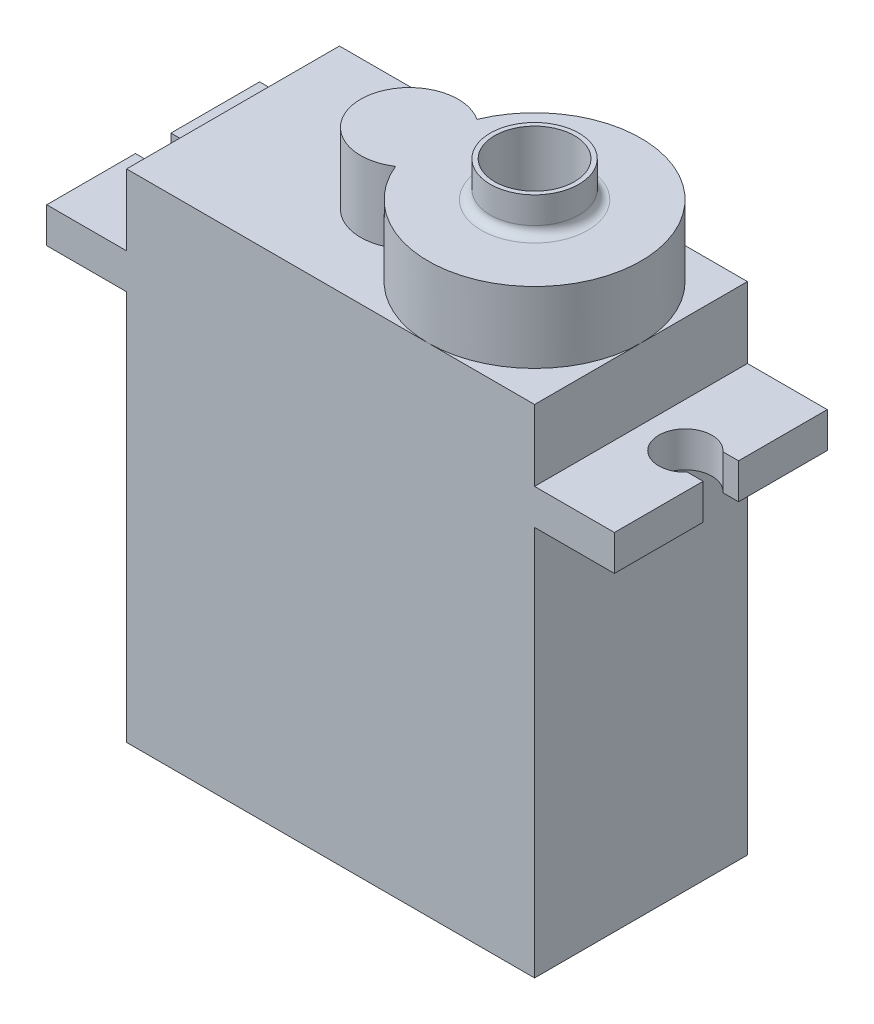
ISO-10303-21;
HEADER;
FILE_DESCRIPTION(('STEP AP214'),'2;1');
FILE_NAME('part.step','',(''),(''),'','','');
FILE_SCHEMA(('AUTOMOTIVE_DESIGN { 1 0 10303 214 1 1 1 1 }'));
ENDSEC;
DATA;
#1=APPLICATION_CONTEXT('core data for automotive mechanical design processes');
#2=APPLICATION_PROTOCOL_DEFINITION('international standard','automotive_design',2000,#1);
#3=PRODUCT_CONTEXT('',#1,'mechanical');
#4=PRODUCT('Part','Part','',(#3));
#5=PRODUCT_RELATED_PRODUCT_CATEGORY('part','',(#4));
#6=PRODUCT_DEFINITION_FORMATION('','',#4);
#7=PRODUCT_DEFINITION_CONTEXT('part definition',#1,'design');
#8=PRODUCT_DEFINITION('design','',#6,#7);
#9=PRODUCT_DEFINITION_SHAPE('','',#8);
#10=(LENGTH_UNIT() NAMED_UNIT(*) SI_UNIT(.MILLI.,.METRE.));
#11=(NAMED_UNIT(*) PLANE_ANGLE_UNIT() SI_UNIT($,.RADIAN.));
#12=(NAMED_UNIT(*) SI_UNIT($,.STERADIAN.) SOLID_ANGLE_UNIT());
#13=UNCERTAINTY_MEASURE_WITH_UNIT(LENGTH_MEASURE(1.E-05),#10,'distance_accuracy_value','');
#14=(GEOMETRIC_REPRESENTATION_CONTEXT(3) GLOBAL_UNCERTAINTY_ASSIGNED_CONTEXT((#13)) GLOBAL_UNIT_ASSIGNED_CONTEXT((#10,
#11,#12)) REPRESENTATION_CONTEXT('',''));
#15=CARTESIAN_POINT('',(0.,0.,0.));
#16=DIRECTION('',(0.,0.,1.));
#17=DIRECTION('',(1.,0.,0.));
#18=AXIS2_PLACEMENT_3D('',#15,#16,#17);
#19=CARTESIAN_POINT('',(0.,28.,0.));
#20=DIRECTION('',(0.,1.,0.));
#21=DIRECTION('',(0.,0.,1.));
#22=AXIS2_PLACEMENT_3D('',#19,#20,#21);
#23=PLANE('',#22);
#24=CARTESIAN_POINT('',(-1.55648325422716,28.,0.));
#25=DIRECTION('',(0.,1.,0.));
#26=DIRECTION('',(0.,0.,1.));
#27=AXIS2_PLACEMENT_3D('',#24,#25,#26);
#28=CIRCLE('',#27,2.75);
#29=CARTESIAN_POINT('',(-0.0432325918384409,28.,-2.2962082729535));
#30=VERTEX_POINT('',#29);
#31=CARTESIAN_POINT('',(-0.0432325918384418,28.,2.2962082729535));
#32=VERTEX_POINT('',#31);
#33=EDGE_CURVE('E220',#30,#32,#28,.T.);
#34=ORIENTED_EDGE('',*,*,#33,.F.);
#35=CARTESIAN_POINT('',(5.5,28.,0.));
#36=DIRECTION('',(0.,1.,0.));
#37=DIRECTION('',(0.,0.,1.));
#38=AXIS2_PLACEMENT_3D('',#35,#36,#37);
#39=CIRCLE('',#38,6.);
#40=CARTESIAN_POINT('',(5.5,28.,-6.));
#41=VERTEX_POINT('',#40);
#42=EDGE_CURVE('E378',#41,#30,#39,.T.);
#43=ORIENTED_EDGE('',*,*,#42,.F.);
#44=DIRECTION('',(-1.,0.,0.));
#45=VECTOR('',#44,1.);
#46=CARTESIAN_POINT('',(-11.5,28.,-6.));
#47=LINE('',#46,#45);
#48=CARTESIAN_POINT('',(-11.5,28.,-6.));
#49=VERTEX_POINT('',#48);
#50=EDGE_CURVE('E231',#41,#49,#47,.T.);
#51=ORIENTED_EDGE('',*,*,#50,.T.);
#52=DIRECTION('',(0.,0.,1.));
#53=VECTOR('',#52,1.);
#54=CARTESIAN_POINT('',(-11.5,28.,-6.));
#55=LINE('',#54,#53);
#56=CARTESIAN_POINT('',(-11.5,28.,6.));
#57=VERTEX_POINT('',#56);
#58=EDGE_CURVE('E236',#49,#57,#55,.T.);
#59=ORIENTED_EDGE('',*,*,#58,.T.);
#60=DIRECTION('',(1.,0.,0.));
#61=VECTOR('',#60,1.);
#62=CARTESIAN_POINT('',(-11.5,28.,6.));
#63=LINE('',#62,#61);
#64=CARTESIAN_POINT('',(5.5,28.,6.));
#65=VERTEX_POINT('',#64);
#66=EDGE_CURVE('E239',#57,#65,#63,.T.);
#67=ORIENTED_EDGE('',*,*,#66,.T.);
#68=EDGE_CURVE('E59',#32,#65,#39,.T.);
#69=ORIENTED_EDGE('',*,*,#68,.F.);
#70=EDGE_LOOP('',(#34,#43,#51,#59,#67,#69));
#71=FACE_BOUND('',#70,.T.);
#72=ADVANCED_FACE('F43',(#71),#23,.T.);
#73=CARTESIAN_POINT('',(11.5,28.,0.));
#74=VERTEX_POINT('',#73);
#75=EDGE_CURVE('E67',#65,#74,#39,.T.);
#76=ORIENTED_EDGE('',*,*,#75,.F.);
#77=CARTESIAN_POINT('',(11.5,28.,6.));
#78=VERTEX_POINT('',#77);
#79=EDGE_CURVE('E238',#65,#78,#63,.T.);
#80=ORIENTED_EDGE('',*,*,#79,.T.);
#81=DIRECTION('',(0.,0.,-1.));
#82=VECTOR('',#81,1.);
#83=CARTESIAN_POINT('',(11.5,28.,-6.));
#84=LINE('',#83,#82);
#85=EDGE_CURVE('E229',#78,#74,#84,.T.);
#86=ORIENTED_EDGE('',*,*,#85,.T.);
#87=EDGE_LOOP('',(#76,#80,#86));
#88=FACE_BOUND('',#87,.T.);
#89=ADVANCED_FACE('F429',(#88),#23,.T.);
#90=CARTESIAN_POINT('',(0.,24.,0.));
#91=DIRECTION('',(0.,1.,0.));
#92=DIRECTION('',(0.,0.,1.));
#93=AXIS2_PLACEMENT_3D('',#90,#91,#92);
#94=PLANE('',#93);
#95=DIRECTION('',(0.,0.,-1.));
#96=VECTOR('',#95,1.);
#97=CARTESIAN_POINT('',(11.5,24.,-6.));
#98=LINE('',#97,#96);
#99=CARTESIAN_POINT('',(11.5,24.,6.));
#100=VERTEX_POINT('',#99);
#101=CARTESIAN_POINT('',(11.5,24.,-6.));
#102=VERTEX_POINT('',#101);
#103=EDGE_CURVE('E221',#100,#102,#98,.T.);
#104=ORIENTED_EDGE('',*,*,#103,.F.);
#105=DIRECTION('',(1.,0.,0.));
#106=VECTOR('',#105,1.);
#107=CARTESIAN_POINT('',(-16.,24.,6.));
#108=LINE('',#107,#106);
#109=CARTESIAN_POINT('',(16.,24.,6.));
#110=VERTEX_POINT('',#109);
#111=EDGE_CURVE('E315',#100,#110,#108,.T.);
#112=ORIENTED_EDGE('',*,*,#111,.T.);
#113=DIRECTION('',(0.,0.,-1.));
#114=VECTOR('',#113,1.);
#115=CARTESIAN_POINT('',(16.,24.,-6.));
#116=LINE('',#115,#114);
#117=CARTESIAN_POINT('',(16.,24.,1.));
#118=VERTEX_POINT('',#117);
#119=EDGE_CURVE('E304',#110,#118,#116,.T.);
#120=ORIENTED_EDGE('',*,*,#119,.T.);
#121=DIRECTION('',(1.,0.,0.));
#122=VECTOR('',#121,1.);
#123=CARTESIAN_POINT('',(17.1213157964989,24.,1.));
#124=LINE('',#123,#122);
#125=CARTESIAN_POINT('',(15.1180339887499,24.,1.));
#126=VERTEX_POINT('',#125);
#127=EDGE_CURVE('E258',#126,#118,#124,.T.);
#128=ORIENTED_EDGE('',*,*,#127,.F.);
#129=CARTESIAN_POINT('',(14.,24.,0.));
#130=DIRECTION('',(0.,1.,0.));
#131=DIRECTION('',(0.,0.,1.));
#132=AXIS2_PLACEMENT_3D('',#129,#130,#131);
#133=CIRCLE('',#132,1.5);
#134=CARTESIAN_POINT('',(15.1180339887499,24.,-1.));
#135=VERTEX_POINT('',#134);
#136=EDGE_CURVE('E256',#135,#126,#133,.T.);
#137=ORIENTED_EDGE('',*,*,#136,.F.);
#138=DIRECTION('',(-1.,0.,0.));
#139=VECTOR('',#138,1.);
#140=CARTESIAN_POINT('',(0.,24.,-1.));
#141=LINE('',#140,#139);
#142=CARTESIAN_POINT('',(16.,24.,-1.));
#143=VERTEX_POINT('',#142);
#144=EDGE_CURVE('E375',#143,#135,#141,.T.);
#145=ORIENTED_EDGE('',*,*,#144,.F.);
#146=CARTESIAN_POINT('',(16.,24.,-6.));
#147=VERTEX_POINT('',#146);
#148=EDGE_CURVE('E308',#143,#147,#116,.T.);
#149=ORIENTED_EDGE('',*,*,#148,.T.);
#150=DIRECTION('',(-1.,0.,0.));
#151=VECTOR('',#150,1.);
#152=CARTESIAN_POINT('',(-16.,24.,-6.));
#153=LINE('',#152,#151);
#154=EDGE_CURVE('E309',#147,#102,#153,.T.);
#155=ORIENTED_EDGE('',*,*,#154,.T.);
#156=EDGE_LOOP('',(#104,#112,#120,#128,#137,#145,#149,#155));
#157=FACE_BOUND('',#156,.T.);
#158=ADVANCED_FACE('F421',(#157),#94,.T.);
#159=CARTESIAN_POINT('',(16.,24.,-6.));
#160=DIRECTION('',(-1.,0.,0.));
#161=DIRECTION('',(0.,0.,1.));
#162=AXIS2_PLACEMENT_3D('',#159,#160,#161);
#163=PLANE('',#162);
#164=ORIENTED_EDGE('',*,*,#148,.F.);
#165=DIRECTION('',(0.,-1.,0.));
#166=VECTOR('',#165,1.);
#167=CARTESIAN_POINT('',(16.,24.,-1.));
#168=LINE('',#167,#166);
#169=CARTESIAN_POINT('',(16.,22.,-1.));
#170=VERTEX_POINT('',#169);
#171=EDGE_CURVE('E294',#143,#170,#168,.T.);
#172=ORIENTED_EDGE('',*,*,#171,.T.);
#173=DIRECTION('',(0.,0.,-1.));
#174=VECTOR('',#173,1.);
#175=CARTESIAN_POINT('',(16.,22.,-6.));
#176=LINE('',#175,#174);
#177=CARTESIAN_POINT('',(16.,22.,-6.));
#178=VERTEX_POINT('',#177);
#179=EDGE_CURVE('E303',#170,#178,#176,.T.);
#180=ORIENTED_EDGE('',*,*,#179,.T.);
#181=DIRECTION('',(0.,-1.,0.));
#182=VECTOR('',#181,1.);
#183=CARTESIAN_POINT('',(16.,24.,-6.));
#184=LINE('',#183,#182);
#185=EDGE_CURVE('E342',#147,#178,#184,.T.);
#186=ORIENTED_EDGE('',*,*,#185,.F.);
#187=EDGE_LOOP('',(#164,#172,#180,#186));
#188=FACE_BOUND('',#187,.T.);
#189=ADVANCED_FACE('F458',(#188),#163,.F.);
#190=CARTESIAN_POINT('',(-16.,24.,-6.));
#191=DIRECTION('',(1.,0.,0.));
#192=DIRECTION('',(0.,0.,-1.));
#193=AXIS2_PLACEMENT_3D('',#190,#191,#192);
#194=PLANE('',#193);
#195=DIRECTION('',(0.,0.,1.));
#196=VECTOR('',#195,1.);
#197=CARTESIAN_POINT('',(-16.,22.,-6.));
#198=LINE('',#197,#196);
#199=CARTESIAN_POINT('',(-16.,22.,-6.));
#200=VERTEX_POINT('',#199);
#201=CARTESIAN_POINT('',(-16.,22.,-1.));
#202=VERTEX_POINT('',#201);
#203=EDGE_CURVE('E327',#200,#202,#198,.T.);
#204=ORIENTED_EDGE('',*,*,#203,.T.);
#205=DIRECTION('',(0.,1.,0.));
#206=VECTOR('',#205,1.);
#207=CARTESIAN_POINT('',(-16.,24.,-1.));
#208=LINE('',#207,#206);
#209=CARTESIAN_POINT('',(-16.,24.,-1.));
#210=VERTEX_POINT('',#209);
#211=EDGE_CURVE('E282',#202,#210,#208,.T.);
#212=ORIENTED_EDGE('',*,*,#211,.T.);
#213=DIRECTION('',(0.,0.,1.));
#214=VECTOR('',#213,1.);
#215=CARTESIAN_POINT('',(-16.,24.,-6.));
#216=LINE('',#215,#214);
#217=CARTESIAN_POINT('',(-16.,24.,-6.));
#218=VERTEX_POINT('',#217);
#219=EDGE_CURVE('E312',#218,#210,#216,.T.);
#220=ORIENTED_EDGE('',*,*,#219,.F.);
#221=DIRECTION('',(0.,-1.,0.));
#222=VECTOR('',#221,1.);
#223=CARTESIAN_POINT('',(-16.,24.,-6.));
#224=LINE('',#223,#222);
#225=EDGE_CURVE('E339',#218,#200,#224,.T.);
#226=ORIENTED_EDGE('',*,*,#225,.T.);
#227=EDGE_LOOP('',(#204,#212,#220,#226));
#228=FACE_BOUND('',#227,.T.);
#229=ADVANCED_FACE('F466',(#228),#194,.F.);
#230=CARTESIAN_POINT('',(11.5,22.,-6.));
#231=DIRECTION('',(-1.,0.,0.));
#232=DIRECTION('',(0.,0.,1.));
#233=AXIS2_PLACEMENT_3D('',#230,#231,#232);
#234=PLANE('',#233);
#235=DIRECTION('',(0.,0.,-1.));
#236=VECTOR('',#235,1.);
#237=CARTESIAN_POINT('',(11.5,0.,-6.));
#238=LINE('',#237,#236);
#239=CARTESIAN_POINT('',(11.5,0.,6.));
#240=VERTEX_POINT('',#239);
#241=CARTESIAN_POINT('',(11.5,0.,-6.));
#242=VERTEX_POINT('',#241);
#243=EDGE_CURVE('E345',#240,#242,#238,.T.);
#244=ORIENTED_EDGE('',*,*,#243,.T.);
#245=DIRECTION('',(0.,-1.,0.));
#246=VECTOR('',#245,1.);
#247=CARTESIAN_POINT('',(11.5,22.,-6.));
#248=LINE('',#247,#246);
#249=CARTESIAN_POINT('',(11.5,22.,-6.));
#250=VERTEX_POINT('',#249);
#251=EDGE_CURVE('E369',#250,#242,#248,.T.);
#252=ORIENTED_EDGE('',*,*,#251,.F.);
#253=DIRECTION('',(0.,0.,-1.));
#254=VECTOR('',#253,1.);
#255=CARTESIAN_POINT('',(11.5,22.,-6.));
#256=LINE('',#255,#254);
#257=CARTESIAN_POINT('',(11.5,22.,6.));
#258=VERTEX_POINT('',#257);
#259=EDGE_CURVE('E346',#258,#250,#256,.T.);
#260=ORIENTED_EDGE('',*,*,#259,.F.);
#261=DIRECTION('',(0.,-1.,0.));
#262=VECTOR('',#261,1.);
#263=CARTESIAN_POINT('',(11.5,22.,6.));
#264=LINE('',#263,#262);
#265=EDGE_CURVE('E353',#258,#240,#264,.T.);
#266=ORIENTED_EDGE('',*,*,#265,.T.);
#267=EDGE_LOOP('',(#244,#252,#260,#266));
#268=FACE_BOUND('',#267,.T.);
#269=ADVANCED_FACE('F394',(#268),#234,.F.);
#270=CARTESIAN_POINT('',(-11.5,22.,-6.));
#271=DIRECTION('',(0.,0.,1.));
#272=DIRECTION('',(1.,0.,0.));
#273=AXIS2_PLACEMENT_3D('',#270,#271,#272);
#274=PLANE('',#273);
#275=CARTESIAN_POINT('',(5.5,6.,-6.));
#276=DIRECTION('',(0.,0.,1.));
#277=DIRECTION('',(1.,0.,0.));
#278=AXIS2_PLACEMENT_3D('',#275,#276,#277);
#279=CIRCLE('',#278,2.25);
#280=CARTESIAN_POINT('',(7.75,6.,-6.));
#281=VERTEX_POINT('',#280);
#282=EDGE_CURVE('E47',#281,#281,#279,.F.);
#283=ORIENTED_EDGE('',*,*,#282,.F.);
#284=EDGE_LOOP('',(#283));
#285=FACE_BOUND('',#284,.T.);
#286=DIRECTION('',(-1.,0.,0.));
#287=VECTOR('',#286,1.);
#288=CARTESIAN_POINT('',(-11.5,0.,-6.));
#289=LINE('',#288,#287);
#290=CARTESIAN_POINT('',(-11.5,0.,-6.));
#291=VERTEX_POINT('',#290);
#292=EDGE_CURVE('E356',#242,#291,#289,.T.);
#293=ORIENTED_EDGE('',*,*,#292,.T.);
#294=DIRECTION('',(0.,-1.,0.));
#295=VECTOR('',#294,1.);
#296=CARTESIAN_POINT('',(-11.5,22.,-6.));
#297=LINE('',#296,#295);
#298=CARTESIAN_POINT('',(-11.5,22.,-6.));
#299=VERTEX_POINT('',#298);
#300=EDGE_CURVE('E366',#299,#291,#297,.T.);
#301=ORIENTED_EDGE('',*,*,#300,.F.);
#302=DIRECTION('',(-1.,0.,0.));
#303=VECTOR('',#302,1.);
#304=CARTESIAN_POINT('',(-16.,22.,-6.));
#305=LINE('',#304,#303);
#306=EDGE_CURVE('E322',#299,#200,#305,.T.);
#307=ORIENTED_EDGE('',*,*,#306,.T.);
#308=ORIENTED_EDGE('',*,*,#225,.F.);
#309=CARTESIAN_POINT('',(-11.5,24.,-6.));
#310=VERTEX_POINT('',#309);
#311=EDGE_CURVE('E307',#310,#218,#153,.T.);
#312=ORIENTED_EDGE('',*,*,#311,.F.);
#313=DIRECTION('',(0.,-1.,0.));
#314=VECTOR('',#313,1.);
#315=CARTESIAN_POINT('',(-11.5,28.,-6.));
#316=LINE('',#315,#314);
#317=EDGE_CURVE('E249',#49,#310,#316,.T.);
#318=ORIENTED_EDGE('',*,*,#317,.F.);
#319=ORIENTED_EDGE('',*,*,#50,.F.);
#320=CARTESIAN_POINT('',(11.5,28.,-6.));
#321=VERTEX_POINT('',#320);
#322=EDGE_CURVE('E233',#321,#41,#47,.T.);
#323=ORIENTED_EDGE('',*,*,#322,.F.);
#324=DIRECTION('',(0.,-1.,0.));
#325=VECTOR('',#324,1.);
#326=CARTESIAN_POINT('',(11.5,28.,-6.));
#327=LINE('',#326,#325);
#328=EDGE_CURVE('E252',#321,#102,#327,.T.);
#329=ORIENTED_EDGE('',*,*,#328,.T.);
#330=ORIENTED_EDGE('',*,*,#154,.F.);
#331=ORIENTED_EDGE('',*,*,#185,.T.);
#332=EDGE_CURVE('E323',#178,#250,#305,.T.);
#333=ORIENTED_EDGE('',*,*,#332,.T.);
#334=ORIENTED_EDGE('',*,*,#251,.T.);
#335=EDGE_LOOP('',(#293,#301,#307,#308,#312,#318,#319,#323,#329,#330,#331,#333,#334));
#336=FACE_BOUND('',#335,.T.);
#337=ADVANCED_FACE('F390',(#285,#336),#274,.F.);
#338=CARTESIAN_POINT('',(-11.5,22.,-6.));
#339=DIRECTION('',(1.,0.,0.));
#340=DIRECTION('',(0.,0.,-1.));
#341=AXIS2_PLACEMENT_3D('',#338,#339,#340);
#342=PLANE('',#341);
#343=DIRECTION('',(0.,0.,1.));
#344=VECTOR('',#343,1.);
#345=CARTESIAN_POINT('',(-11.5,0.,-6.));
#346=LINE('',#345,#344);
#347=CARTESIAN_POINT('',(-11.5,0.,6.));
#348=VERTEX_POINT('',#347);
#349=EDGE_CURVE('E358',#291,#348,#346,.T.);
#350=ORIENTED_EDGE('',*,*,#349,.T.);
#351=DIRECTION('',(0.,-1.,0.));
#352=VECTOR('',#351,1.);
#353=CARTESIAN_POINT('',(-11.5,22.,6.));
#354=LINE('',#353,#352);
#355=CARTESIAN_POINT('',(-11.5,22.,6.));
#356=VERTEX_POINT('',#355);
#357=EDGE_CURVE('E363',#356,#348,#354,.T.);
#358=ORIENTED_EDGE('',*,*,#357,.F.);
#359=DIRECTION('',(0.,0.,1.));
#360=VECTOR('',#359,1.);
#361=CARTESIAN_POINT('',(-11.5,22.,-6.));
#362=LINE('',#361,#360);
#363=EDGE_CURVE('E349',#299,#356,#362,.T.);
#364=ORIENTED_EDGE('',*,*,#363,.F.);
#365=ORIENTED_EDGE('',*,*,#300,.T.);
#366=EDGE_LOOP('',(#350,#358,#364,#365));
#367=FACE_BOUND('',#366,.T.);
#368=ADVANCED_FACE('F393',(#367),#342,.F.);
#369=CARTESIAN_POINT('',(-11.5,22.,6.));
#370=DIRECTION('',(0.,0.,-1.));
#371=DIRECTION('',(-1.,0.,0.));
#372=AXIS2_PLACEMENT_3D('',#369,#370,#371);
#373=PLANE('',#372);
#374=DIRECTION('',(1.,0.,0.));
#375=VECTOR('',#374,1.);
#376=CARTESIAN_POINT('',(-11.5,0.,6.));
#377=LINE('',#376,#375);
#378=EDGE_CURVE('E350',#348,#240,#377,.T.);
#379=ORIENTED_EDGE('',*,*,#378,.T.);
#380=ORIENTED_EDGE('',*,*,#265,.F.);
#381=DIRECTION('',(1.,0.,0.));
#382=VECTOR('',#381,1.);
#383=CARTESIAN_POINT('',(-16.,22.,6.));
#384=LINE('',#383,#382);
#385=CARTESIAN_POINT('',(16.,22.,6.));
#386=VERTEX_POINT('',#385);
#387=EDGE_CURVE('E330',#258,#386,#384,.T.);
#388=ORIENTED_EDGE('',*,*,#387,.T.);
#389=DIRECTION('',(0.,-1.,0.));
#390=VECTOR('',#389,1.);
#391=CARTESIAN_POINT('',(16.,24.,6.));
#392=LINE('',#391,#390);
#393=EDGE_CURVE('E318',#110,#386,#392,.T.);
#394=ORIENTED_EDGE('',*,*,#393,.F.);
#395=ORIENTED_EDGE('',*,*,#111,.F.);
#396=DIRECTION('',(0.,-1.,0.));
#397=VECTOR('',#396,1.);
#398=CARTESIAN_POINT('',(11.5,28.,6.));
#399=LINE('',#398,#397);
#400=EDGE_CURVE('E240',#78,#100,#399,.T.);
#401=ORIENTED_EDGE('',*,*,#400,.F.);
#402=ORIENTED_EDGE('',*,*,#79,.F.);
#403=ORIENTED_EDGE('',*,*,#66,.F.);
#404=DIRECTION('',(0.,-1.,0.));
#405=VECTOR('',#404,1.);
#406=CARTESIAN_POINT('',(-11.5,28.,6.));
#407=LINE('',#406,#405);
#408=CARTESIAN_POINT('',(-11.5,24.,6.));
#409=VERTEX_POINT('',#408);
#410=EDGE_CURVE('E246',#57,#409,#407,.T.);
#411=ORIENTED_EDGE('',*,*,#410,.T.);
#412=CARTESIAN_POINT('',(-16.,24.,6.));
#413=VERTEX_POINT('',#412);
#414=EDGE_CURVE('E316',#413,#409,#108,.T.);
#415=ORIENTED_EDGE('',*,*,#414,.F.);
#416=DIRECTION('',(0.,-1.,0.));
#417=VECTOR('',#416,1.);
#418=CARTESIAN_POINT('',(-16.,24.,6.));
#419=LINE('',#418,#417);
#420=CARTESIAN_POINT('',(-16.,22.,6.));
#421=VERTEX_POINT('',#420);
#422=EDGE_CURVE('E336',#413,#421,#419,.T.);
#423=ORIENTED_EDGE('',*,*,#422,.T.);
#424=EDGE_CURVE('E331',#421,#356,#384,.T.);
#425=ORIENTED_EDGE('',*,*,#424,.T.);
#426=ORIENTED_EDGE('',*,*,#357,.T.);
#427=EDGE_LOOP('',(#379,#380,#388,#394,#395,#401,#402,#403,#411,#415,#423,#425,#426));
#428=FACE_BOUND('',#427,.T.);
#429=ADVANCED_FACE('F405',(#428),#373,.F.);
#430=CARTESIAN_POINT('',(0.,0.,0.));
#431=DIRECTION('',(0.,1.,0.));
#432=DIRECTION('',(0.,0.,1.));
#433=AXIS2_PLACEMENT_3D('',#430,#431,#432);
#434=PLANE('',#433);
#435=ORIENTED_EDGE('',*,*,#243,.F.);
#436=ORIENTED_EDGE('',*,*,#378,.F.);
#437=ORIENTED_EDGE('',*,*,#349,.F.);
#438=ORIENTED_EDGE('',*,*,#292,.F.);
#439=EDGE_LOOP('',(#435,#436,#437,#438));
#440=FACE_BOUND('',#439,.T.);
#441=ADVANCED_FACE('F403',(#440),#434,.F.);
#442=CARTESIAN_POINT('',(0.,22.,0.));
#443=DIRECTION('',(0.,1.,0.));
#444=DIRECTION('',(0.,0.,1.));
#445=AXIS2_PLACEMENT_3D('',#442,#443,#444);
#446=PLANE('',#445);
#447=ORIENTED_EDGE('',*,*,#179,.F.);
#448=DIRECTION('',(-1.,0.,0.));
#449=VECTOR('',#448,1.);
#450=CARTESIAN_POINT('',(0.,22.,-1.));
#451=LINE('',#450,#449);
#452=CARTESIAN_POINT('',(15.1180339887499,22.,-1.));
#453=VERTEX_POINT('',#452);
#454=EDGE_CURVE('E297',#170,#453,#451,.T.);
#455=ORIENTED_EDGE('',*,*,#454,.T.);
#456=CARTESIAN_POINT('',(14.,22.,0.));
#457=DIRECTION('',(0.,1.,0.));
#458=DIRECTION('',(0.,0.,1.));
#459=AXIS2_PLACEMENT_3D('',#456,#457,#458);
#460=CIRCLE('',#459,1.5);
#461=CARTESIAN_POINT('',(15.1180339887499,22.,1.));
#462=VERTEX_POINT('',#461);
#463=EDGE_CURVE('E300',#453,#462,#460,.T.);
#464=ORIENTED_EDGE('',*,*,#463,.T.);
#465=DIRECTION('',(1.,0.,0.));
#466=VECTOR('',#465,1.);
#467=CARTESIAN_POINT('',(0.,22.,1.));
#468=LINE('',#467,#466);
#469=CARTESIAN_POINT('',(16.,22.,1.));
#470=VERTEX_POINT('',#469);
#471=EDGE_CURVE('E291',#462,#470,#468,.T.);
#472=ORIENTED_EDGE('',*,*,#471,.T.);
#473=EDGE_CURVE('E319',#386,#470,#176,.T.);
#474=ORIENTED_EDGE('',*,*,#473,.F.);
#475=ORIENTED_EDGE('',*,*,#387,.F.);
#476=ORIENTED_EDGE('',*,*,#259,.T.);
#477=ORIENTED_EDGE('',*,*,#332,.F.);
#478=EDGE_LOOP('',(#447,#455,#464,#472,#474,#475,#476,#477));
#479=FACE_BOUND('',#478,.T.);
#480=ADVANCED_FACE('F413',(#479),#446,.F.);
#481=CARTESIAN_POINT('',(-14.,22.,0.));
#482=DIRECTION('',(0.,1.,0.));
#483=DIRECTION('',(0.,0.,1.));
#484=AXIS2_PLACEMENT_3D('',#481,#482,#483);
#485=CIRCLE('',#484,1.5);
#486=CARTESIAN_POINT('',(-15.1180339887499,22.,1.));
#487=VERTEX_POINT('',#486);
#488=CARTESIAN_POINT('',(-15.1180339887499,22.,-1.));
#489=VERTEX_POINT('',#488);
#490=EDGE_CURVE('E279',#487,#489,#485,.T.);
#491=ORIENTED_EDGE('',*,*,#490,.T.);
#492=DIRECTION('',(-1.,0.,0.));
#493=VECTOR('',#492,1.);
#494=CARTESIAN_POINT('',(0.,22.,-1.));
#495=LINE('',#494,#493);
#496=EDGE_CURVE('E285',#489,#202,#495,.T.);
#497=ORIENTED_EDGE('',*,*,#496,.T.);
#498=ORIENTED_EDGE('',*,*,#203,.F.);
#499=ORIENTED_EDGE('',*,*,#306,.F.);
#500=ORIENTED_EDGE('',*,*,#363,.T.);
#501=ORIENTED_EDGE('',*,*,#424,.F.);
#502=CARTESIAN_POINT('',(-16.,22.,1.));
#503=VERTEX_POINT('',#502);
#504=EDGE_CURVE('E326',#503,#421,#198,.T.);
#505=ORIENTED_EDGE('',*,*,#504,.F.);
#506=DIRECTION('',(1.,0.,0.));
#507=VECTOR('',#506,1.);
#508=CARTESIAN_POINT('',(0.,22.,0.999999999999998));
#509=LINE('',#508,#507);
#510=EDGE_CURVE('E276',#503,#487,#509,.T.);
#511=ORIENTED_EDGE('',*,*,#510,.T.);
#512=EDGE_LOOP('',(#491,#497,#498,#499,#500,#501,#505,#511));
#513=FACE_BOUND('',#512,.T.);
#514=ADVANCED_FACE('F492',(#513),#446,.F.);
#515=ORIENTED_EDGE('',*,*,#473,.T.);
#516=DIRECTION('',(0.,1.,0.));
#517=VECTOR('',#516,1.);
#518=CARTESIAN_POINT('',(16.,24.,1.));
#519=LINE('',#518,#517);
#520=EDGE_CURVE('E288',#470,#118,#519,.T.);
#521=ORIENTED_EDGE('',*,*,#520,.T.);
#522=ORIENTED_EDGE('',*,*,#119,.F.);
#523=ORIENTED_EDGE('',*,*,#393,.T.);
#524=EDGE_LOOP('',(#515,#521,#522,#523));
#525=FACE_BOUND('',#524,.T.);
#526=ADVANCED_FACE('F418',(#525),#163,.F.);
#527=CARTESIAN_POINT('',(-16.,24.,1.));
#528=VERTEX_POINT('',#527);
#529=EDGE_CURVE('E311',#528,#413,#216,.T.);
#530=ORIENTED_EDGE('',*,*,#529,.F.);
#531=DIRECTION('',(0.,-1.,0.));
#532=VECTOR('',#531,1.);
#533=CARTESIAN_POINT('',(-16.,24.,1.));
#534=LINE('',#533,#532);
#535=EDGE_CURVE('E264',#528,#503,#534,.T.);
#536=ORIENTED_EDGE('',*,*,#535,.T.);
#537=ORIENTED_EDGE('',*,*,#504,.T.);
#538=ORIENTED_EDGE('',*,*,#422,.F.);
#539=EDGE_LOOP('',(#530,#536,#537,#538));
#540=FACE_BOUND('',#539,.T.);
#541=ADVANCED_FACE('F472',(#540),#194,.F.);
#542=DIRECTION('',(0.,0.,1.));
#543=VECTOR('',#542,1.);
#544=CARTESIAN_POINT('',(-11.5,24.,-6.));
#545=LINE('',#544,#543);
#546=EDGE_CURVE('E224',#310,#409,#545,.T.);
#547=ORIENTED_EDGE('',*,*,#546,.F.);
#548=ORIENTED_EDGE('',*,*,#311,.T.);
#549=ORIENTED_EDGE('',*,*,#219,.T.);
#550=DIRECTION('',(-1.,0.,0.));
#551=VECTOR('',#550,1.);
#552=CARTESIAN_POINT('',(-16.6395471701905,24.,-1.));
#553=LINE('',#552,#551);
#554=CARTESIAN_POINT('',(-15.1180339887499,24.,-1.));
#555=VERTEX_POINT('',#554);
#556=EDGE_CURVE('E269',#555,#210,#553,.T.);
#557=ORIENTED_EDGE('',*,*,#556,.F.);
#558=CARTESIAN_POINT('',(-14.,24.,0.));
#559=DIRECTION('',(0.,1.,0.));
#560=DIRECTION('',(0.,0.,1.));
#561=AXIS2_PLACEMENT_3D('',#558,#559,#560);
#562=CIRCLE('',#561,1.5);
#563=CARTESIAN_POINT('',(-15.1180339887499,24.,1.));
#564=VERTEX_POINT('',#563);
#565=EDGE_CURVE('E259',#564,#555,#562,.T.);
#566=ORIENTED_EDGE('',*,*,#565,.F.);
#567=DIRECTION('',(1.,0.,0.));
#568=VECTOR('',#567,1.);
#569=CARTESIAN_POINT('',(0.,24.,0.999999999999998));
#570=LINE('',#569,#568);
#571=EDGE_CURVE('E372',#528,#564,#570,.T.);
#572=ORIENTED_EDGE('',*,*,#571,.F.);
#573=ORIENTED_EDGE('',*,*,#529,.T.);
#574=ORIENTED_EDGE('',*,*,#414,.T.);
#575=EDGE_LOOP('',(#547,#548,#549,#557,#566,#572,#573,#574));
#576=FACE_BOUND('',#575,.T.);
#577=ADVANCED_FACE('F460',(#576),#94,.T.);
#578=CARTESIAN_POINT('',(-16.6395471701905,19.,-1.));
#579=DIRECTION('',(0.,0.,-1.));
#580=DIRECTION('',(-1.,0.,0.));
#581=AXIS2_PLACEMENT_3D('',#578,#579,#580);
#582=PLANE('',#581);
#583=DIRECTION('',(0.,1.,0.));
#584=VECTOR('',#583,1.);
#585=CARTESIAN_POINT('',(-15.1180339887499,19.,-1.));
#586=LINE('',#585,#584);
#587=EDGE_CURVE('E255',#489,#555,#586,.T.);
#588=ORIENTED_EDGE('',*,*,#587,.T.);
#589=ORIENTED_EDGE('',*,*,#556,.T.);
#590=ORIENTED_EDGE('',*,*,#211,.F.);
#591=ORIENTED_EDGE('',*,*,#496,.F.);
#592=EDGE_LOOP('',(#588,#589,#590,#591));
#593=FACE_BOUND('',#592,.T.);
#594=ADVANCED_FACE('F471',(#593),#582,.F.);
#595=CARTESIAN_POINT('',(-14.,19.,0.));
#596=DIRECTION('',(0.,1.,0.));
#597=DIRECTION('',(0.,0.,1.));
#598=AXIS2_PLACEMENT_3D('',#595,#596,#597);
#599=CYLINDRICAL_SURFACE('',#598,1.5);
#600=DIRECTION('',(0.,1.,0.));
#601=VECTOR('',#600,1.);
#602=CARTESIAN_POINT('',(-15.1180339887499,19.,1.));
#603=LINE('',#602,#601);
#604=EDGE_CURVE('E267',#487,#564,#603,.T.);
#605=ORIENTED_EDGE('',*,*,#604,.T.);
#606=ORIENTED_EDGE('',*,*,#565,.T.);
#607=ORIENTED_EDGE('',*,*,#587,.F.);
#608=ORIENTED_EDGE('',*,*,#490,.F.);
#609=EDGE_LOOP('',(#605,#606,#607,#608));
#610=FACE_BOUND('',#609,.T.);
#611=ADVANCED_FACE('F477',(#610),#599,.F.);
#612=CARTESIAN_POINT('',(-16.6395471701905,19.,1.));
#613=DIRECTION('',(0.,0.,1.));
#614=DIRECTION('',(1.,0.,0.));
#615=AXIS2_PLACEMENT_3D('',#612,#613,#614);
#616=PLANE('',#615);
#617=ORIENTED_EDGE('',*,*,#535,.F.);
#618=ORIENTED_EDGE('',*,*,#571,.T.);
#619=ORIENTED_EDGE('',*,*,#604,.F.);
#620=ORIENTED_EDGE('',*,*,#510,.F.);
#621=EDGE_LOOP('',(#617,#618,#619,#620));
#622=FACE_BOUND('',#621,.T.);
#623=ADVANCED_FACE('F502',(#622),#616,.F.);
#624=CARTESIAN_POINT('',(14.,19.,0.));
#625=DIRECTION('',(0.,1.,0.));
#626=DIRECTION('',(0.,0.,1.));
#627=AXIS2_PLACEMENT_3D('',#624,#625,#626);
#628=CYLINDRICAL_SURFACE('',#627,1.5);
#629=DIRECTION('',(0.,1.,0.));
#630=VECTOR('',#629,1.);
#631=CARTESIAN_POINT('',(15.1180339887499,19.,-1.));
#632=LINE('',#631,#630);
#633=EDGE_CURVE('E262',#453,#135,#632,.T.);
#634=ORIENTED_EDGE('',*,*,#633,.T.);
#635=ORIENTED_EDGE('',*,*,#136,.T.);
#636=DIRECTION('',(0.,1.,0.));
#637=VECTOR('',#636,1.);
#638=CARTESIAN_POINT('',(15.1180339887499,19.,1.));
#639=LINE('',#638,#637);
#640=EDGE_CURVE('E261',#462,#126,#639,.T.);
#641=ORIENTED_EDGE('',*,*,#640,.F.);
#642=ORIENTED_EDGE('',*,*,#463,.F.);
#643=EDGE_LOOP('',(#634,#635,#641,#642));
#644=FACE_BOUND('',#643,.T.);
#645=ADVANCED_FACE('F504',(#644),#628,.F.);
#646=CARTESIAN_POINT('',(15.1180339887499,19.,-1.));
#647=DIRECTION('',(0.,0.,-1.));
#648=DIRECTION('',(-1.,0.,0.));
#649=AXIS2_PLACEMENT_3D('',#646,#647,#648);
#650=PLANE('',#649);
#651=ORIENTED_EDGE('',*,*,#171,.F.);
#652=ORIENTED_EDGE('',*,*,#144,.T.);
#653=ORIENTED_EDGE('',*,*,#633,.F.);
#654=ORIENTED_EDGE('',*,*,#454,.F.);
#655=EDGE_LOOP('',(#651,#652,#653,#654));
#656=FACE_BOUND('',#655,.T.);
#657=ADVANCED_FACE('F510',(#656),#650,.F.);
#658=CARTESIAN_POINT('',(17.1213157964989,19.,1.));
#659=DIRECTION('',(0.,0.,1.));
#660=DIRECTION('',(1.,0.,0.));
#661=AXIS2_PLACEMENT_3D('',#658,#659,#660);
#662=PLANE('',#661);
#663=ORIENTED_EDGE('',*,*,#640,.T.);
#664=ORIENTED_EDGE('',*,*,#127,.T.);
#665=ORIENTED_EDGE('',*,*,#520,.F.);
#666=ORIENTED_EDGE('',*,*,#471,.F.);
#667=EDGE_LOOP('',(#663,#664,#665,#666));
#668=FACE_BOUND('',#667,.T.);
#669=ADVANCED_FACE('F515',(#668),#662,.F.);
#670=CARTESIAN_POINT('',(11.5,28.,-6.));
#671=DIRECTION('',(-1.,0.,0.));
#672=DIRECTION('',(0.,0.,1.));
#673=AXIS2_PLACEMENT_3D('',#670,#671,#672);
#674=PLANE('',#673);
#675=ORIENTED_EDGE('',*,*,#103,.T.);
#676=ORIENTED_EDGE('',*,*,#328,.F.);
#677=EDGE_CURVE('E232',#74,#321,#84,.T.);
#678=ORIENTED_EDGE('',*,*,#677,.F.);
#679=ORIENTED_EDGE('',*,*,#85,.F.);
#680=ORIENTED_EDGE('',*,*,#400,.T.);
#681=EDGE_LOOP('',(#675,#676,#678,#679,#680));
#682=FACE_BOUND('',#681,.T.);
#683=ADVANCED_FACE('F426',(#682),#674,.F.);
#684=CARTESIAN_POINT('',(-11.5,28.,-6.));
#685=DIRECTION('',(1.,0.,0.));
#686=DIRECTION('',(0.,0.,-1.));
#687=AXIS2_PLACEMENT_3D('',#684,#685,#686);
#688=PLANE('',#687);
#689=ORIENTED_EDGE('',*,*,#546,.T.);
#690=ORIENTED_EDGE('',*,*,#410,.F.);
#691=ORIENTED_EDGE('',*,*,#58,.F.);
#692=ORIENTED_EDGE('',*,*,#317,.T.);
#693=EDGE_LOOP('',(#689,#690,#691,#692));
#694=FACE_BOUND('',#693,.T.);
#695=ADVANCED_FACE('F442',(#694),#688,.F.);
#696=EDGE_CURVE('E431',#74,#41,#39,.T.);
#697=ORIENTED_EDGE('',*,*,#696,.F.);
#698=ORIENTED_EDGE('',*,*,#677,.T.);
#699=ORIENTED_EDGE('',*,*,#322,.T.);
#700=EDGE_LOOP('',(#697,#698,#699));
#701=FACE_BOUND('',#700,.T.);
#702=ADVANCED_FACE('F440',(#701),#23,.T.);
#703=CARTESIAN_POINT('',(-1.55648325422716,32.,0.));
#704=DIRECTION('',(0.,-1.,0.));
#705=DIRECTION('',(0.,0.,-1.));
#706=AXIS2_PLACEMENT_3D('',#703,#704,#705);
#707=CYLINDRICAL_SURFACE('',#706,2.75);
#708=ORIENTED_EDGE('',*,*,#33,.T.);
#709=DIRECTION('',(0.,-1.,0.));
#710=VECTOR('',#709,1.);
#711=CARTESIAN_POINT('',(-0.0432325918384418,32.,2.2962082729535));
#712=LINE('',#711,#710);
#713=CARTESIAN_POINT('',(-0.0432325918384418,32.,2.2962082729535));
#714=VERTEX_POINT('',#713);
#715=EDGE_CURVE('E207',#714,#32,#712,.T.);
#716=ORIENTED_EDGE('',*,*,#715,.F.);
#717=CARTESIAN_POINT('',(-1.55648325422716,32.,0.));
#718=DIRECTION('',(0.,1.,0.));
#719=DIRECTION('',(0.,0.,1.));
#720=AXIS2_PLACEMENT_3D('',#717,#718,#719);
#721=CIRCLE('',#720,2.75);
#722=CARTESIAN_POINT('',(-0.0432325918384409,32.,-2.2962082729535));
#723=VERTEX_POINT('',#722);
#724=EDGE_CURVE('E214',#723,#714,#721,.T.);
#725=ORIENTED_EDGE('',*,*,#724,.F.);
#726=DIRECTION('',(0.,-1.,0.));
#727=VECTOR('',#726,1.);
#728=CARTESIAN_POINT('',(-0.0432325918384409,32.,-2.2962082729535));
#729=LINE('',#728,#727);
#730=EDGE_CURVE('E211',#723,#30,#729,.T.);
#731=ORIENTED_EDGE('',*,*,#730,.T.);
#732=EDGE_LOOP('',(#708,#716,#725,#731));
#733=FACE_BOUND('',#732,.T.);
#734=ADVANCED_FACE('F219',(#733),#707,.T.);
#735=CARTESIAN_POINT('',(5.5,32.,0.));
#736=DIRECTION('',(0.,-1.,0.));
#737=DIRECTION('',(0.,0.,-1.));
#738=AXIS2_PLACEMENT_3D('',#735,#736,#737);
#739=CYLINDRICAL_SURFACE('',#738,6.);
#740=ORIENTED_EDGE('',*,*,#68,.T.);
#741=ORIENTED_EDGE('',*,*,#75,.T.);
#742=ORIENTED_EDGE('',*,*,#696,.T.);
#743=ORIENTED_EDGE('',*,*,#42,.T.);
#744=ORIENTED_EDGE('',*,*,#730,.F.);
#745=CARTESIAN_POINT('',(5.5,32.,0.));
#746=DIRECTION('',(0.,1.,0.));
#747=DIRECTION('',(0.,0.,1.));
#748=AXIS2_PLACEMENT_3D('',#745,#746,#747);
#749=CIRCLE('',#748,6.);
#750=EDGE_CURVE('E203',#714,#723,#749,.T.);
#751=ORIENTED_EDGE('',*,*,#750,.F.);
#752=ORIENTED_EDGE('',*,*,#715,.T.);
#753=EDGE_LOOP('',(#740,#741,#742,#743,#744,#751,#752));
#754=FACE_BOUND('',#753,.T.);
#755=ADVANCED_FACE('F205',(#754),#739,.T.);
#756=CARTESIAN_POINT('',(1.97175837288642,32.,0.));
#757=DIRECTION('',(0.,1.,0.));
#758=DIRECTION('',(0.,0.,1.));
#759=AXIS2_PLACEMENT_3D('',#756,#757,#758);
#760=PLANE('',#759);
#761=CARTESIAN_POINT('',(5.5,32.,0.));
#762=DIRECTION('',(0.,1.,0.));
#763=DIRECTION('',(0.,0.,1.));
#764=AXIS2_PLACEMENT_3D('',#761,#762,#763);
#765=CIRCLE('',#764,3.);
#766=CARTESIAN_POINT('',(5.5,32.,3.));
#767=VERTEX_POINT('',#766);
#768=EDGE_CURVE('E381',#767,#767,#765,.F.);
#769=ORIENTED_EDGE('',*,*,#768,.T.);
#770=EDGE_LOOP('',(#769));
#771=FACE_BOUND('',#770,.T.);
#772=ORIENTED_EDGE('',*,*,#724,.T.);
#773=ORIENTED_EDGE('',*,*,#750,.T.);
#774=EDGE_LOOP('',(#772,#773));
#775=FACE_BOUND('',#774,.T.);
#776=ADVANCED_FACE('F216',(#771,#775),#760,.T.);
#777=CARTESIAN_POINT('',(5.5,34.,0.));
#778=DIRECTION('',(0.,1.,0.));
#779=DIRECTION('',(0.,0.,1.));
#780=AXIS2_PLACEMENT_3D('',#777,#778,#779);
#781=PLANE('',#780);
#782=CARTESIAN_POINT('',(5.5,34.,0.));
#783=DIRECTION('',(0.,1.,0.));
#784=DIRECTION('',(0.,0.,1.));
#785=AXIS2_PLACEMENT_3D('',#782,#783,#784);
#786=CIRCLE('',#785,2.5);
#787=CARTESIAN_POINT('',(5.5,34.,2.5));
#788=VERTEX_POINT('',#787);
#789=EDGE_CURVE('E433',#788,#788,#786,.T.);
#790=ORIENTED_EDGE('',*,*,#789,.T.);
#791=EDGE_LOOP('',(#790));
#792=FACE_BOUND('',#791,.T.);
#793=CARTESIAN_POINT('',(5.5,34.,0.));
#794=DIRECTION('',(0.,1.,0.));
#795=DIRECTION('',(0.,0.,1.));
#796=AXIS2_PLACEMENT_3D('',#793,#794,#795);
#797=CIRCLE('',#796,2.25);
#798=CARTESIAN_POINT('',(5.5,34.,2.25));
#799=VERTEX_POINT('',#798);
#800=EDGE_CURVE('E788',#799,#799,#797,.T.);
#801=ORIENTED_EDGE('',*,*,#800,.F.);
#802=EDGE_LOOP('',(#801));
#803=FACE_BOUND('',#802,.T.);
#804=ADVANCED_FACE('F694',(#792,#803),#781,.T.);
#805=CARTESIAN_POINT('',(5.5,34.,0.));
#806=DIRECTION('',(0.,-1.,0.));
#807=DIRECTION('',(0.,0.,-1.));
#808=AXIS2_PLACEMENT_3D('',#805,#806,#807);
#809=CYLINDRICAL_SURFACE('',#808,2.5);
#810=CARTESIAN_POINT('',(5.5,32.5,0.));
#811=DIRECTION('',(0.,1.,0.));
#812=DIRECTION('',(0.,0.,1.));
#813=AXIS2_PLACEMENT_3D('',#810,#811,#812);
#814=CIRCLE('',#813,2.5);
#815=CARTESIAN_POINT('',(5.5,32.5,2.5));
#816=VERTEX_POINT('',#815);
#817=EDGE_CURVE('E379',#816,#816,#814,.T.);
#818=ORIENTED_EDGE('',*,*,#817,.T.);
#819=EDGE_LOOP('',(#818));
#820=FACE_BOUND('',#819,.T.);
#821=ORIENTED_EDGE('',*,*,#789,.F.);
#822=EDGE_LOOP('',(#821));
#823=FACE_BOUND('',#822,.T.);
#824=ADVANCED_FACE('F702',(#820,#823),#809,.T.);
#825=CARTESIAN_POINT('',(5.5,34.,0.));
#826=DIRECTION('',(0.,-1.,0.));
#827=DIRECTION('',(0.,0.,-1.));
#828=AXIS2_PLACEMENT_3D('',#825,#826,#827);
#829=CYLINDRICAL_SURFACE('',#828,2.25);
#830=ORIENTED_EDGE('',*,*,#800,.T.);
#831=EDGE_LOOP('',(#830));
#832=FACE_BOUND('',#831,.T.);
#833=CARTESIAN_POINT('',(5.5,28.,0.));
#834=DIRECTION('',(0.,1.,0.));
#835=DIRECTION('',(0.,0.,1.));
#836=AXIS2_PLACEMENT_3D('',#833,#834,#835);
#837=CIRCLE('',#836,2.25);
#838=CARTESIAN_POINT('',(5.5,28.,2.25));
#839=VERTEX_POINT('',#838);
#840=EDGE_CURVE('E783',#839,#839,#837,.T.);
#841=ORIENTED_EDGE('',*,*,#840,.F.);
#842=EDGE_LOOP('',(#841));
#843=FACE_BOUND('',#842,.T.);
#844=ADVANCED_FACE('F711',(#832,#843),#829,.F.);
#845=CARTESIAN_POINT('',(5.5,28.,0.));
#846=DIRECTION('',(0.,1.,0.));
#847=DIRECTION('',(0.,0.,1.));
#848=AXIS2_PLACEMENT_3D('',#845,#846,#847);
#849=PLANE('',#848);
#850=ORIENTED_EDGE('',*,*,#840,.T.);
#851=EDGE_LOOP('',(#850));
#852=FACE_BOUND('',#851,.T.);
#853=ADVANCED_FACE('F720',(#852),#849,.T.);
#854=CARTESIAN_POINT('',(5.5,32.5,0.));
#855=DIRECTION('',(0.,1.,0.));
#856=DIRECTION('',(0.,0.,1.));
#857=AXIS2_PLACEMENT_3D('',#854,#855,#856);
#858=TOROIDAL_SURFACE('',#857,3.,0.5);
#859=ORIENTED_EDGE('',*,*,#768,.F.);
#860=EDGE_LOOP('',(#859));
#861=FACE_BOUND('',#860,.T.);
#862=ORIENTED_EDGE('',*,*,#817,.F.);
#863=EDGE_LOOP('',(#862));
#864=FACE_BOUND('',#863,.T.);
#865=ADVANCED_FACE('F45',(#861,#864),#858,.F.);
#866=CARTESIAN_POINT('',(5.5,6.,-7.));
#867=DIRECTION('',(0.,0.,1.));
#868=DIRECTION('',(1.,0.,0.));
#869=AXIS2_PLACEMENT_3D('',#866,#867,#868);
#870=CYLINDRICAL_SURFACE('',#869,2.25);
#871=CARTESIAN_POINT('',(5.5,6.,-7.));
#872=DIRECTION('',(0.,0.,-1.));
#873=DIRECTION('',(-1.,0.,0.));
#874=AXIS2_PLACEMENT_3D('',#871,#872,#873);
#875=CIRCLE('',#874,2.25);
#876=CARTESIAN_POINT('',(3.25,6.,-7.));
#877=VERTEX_POINT('',#876);
#878=EDGE_CURVE('E780',#877,#877,#875,.T.);
#879=ORIENTED_EDGE('',*,*,#878,.F.);
#880=EDGE_LOOP('',(#879));
#881=FACE_BOUND('',#880,.T.);
#882=ORIENTED_EDGE('',*,*,#282,.T.);
#883=EDGE_LOOP('',(#882));
#884=FACE_BOUND('',#883,.T.);
#885=ADVANCED_FACE('F388',(#881,#884),#870,.T.);
#886=CARTESIAN_POINT('',(5.5,6.,-7.));
#887=DIRECTION('',(0.,0.,-1.));
#888=DIRECTION('',(-1.,0.,0.));
#889=AXIS2_PLACEMENT_3D('',#886,#887,#888);
#890=PLANE('',#889);
#891=CARTESIAN_POINT('',(5.5,6.,-7.));
#892=DIRECTION('',(0.,0.,-1.));
#893=DIRECTION('',(-1.,0.,0.));
#894=AXIS2_PLACEMENT_3D('',#891,#892,#893);
#895=CIRCLE('',#894,0.75);
#896=CARTESIAN_POINT('',(4.75,6.,-7.));
#897=VERTEX_POINT('',#896);
#898=EDGE_CURVE('E11',#897,#897,#895,.T.);
#899=ORIENTED_EDGE('',*,*,#898,.F.);
#900=EDGE_LOOP('',(#899));
#901=FACE_BOUND('',#900,.T.);
#902=ORIENTED_EDGE('',*,*,#878,.T.);
#903=EDGE_LOOP('',(#902));
#904=FACE_BOUND('',#903,.T.);
#905=ADVANCED_FACE('F743',(#901,#904),#890,.T.);
#906=CARTESIAN_POINT('',(5.5,6.,-9.));
#907=DIRECTION('',(0.,0.,1.));
#908=DIRECTION('',(1.,0.,0.));
#909=AXIS2_PLACEMENT_3D('',#906,#907,#908);
#910=CYLINDRICAL_SURFACE('',#909,0.75);
#911=CARTESIAN_POINT('',(5.5,6.,-9.));
#912=DIRECTION('',(0.,0.,-1.));
#913=DIRECTION('',(-1.,0.,0.));
#914=AXIS2_PLACEMENT_3D('',#911,#912,#913);
#915=CIRCLE('',#914,0.75);
#916=CARTESIAN_POINT('',(4.75,6.,-9.));
#917=VERTEX_POINT('',#916);
#918=EDGE_CURVE('E779',#917,#917,#915,.T.);
#919=ORIENTED_EDGE('',*,*,#918,.F.);
#920=EDGE_LOOP('',(#919));
#921=FACE_BOUND('',#920,.T.);
#922=ORIENTED_EDGE('',*,*,#898,.T.);
#923=EDGE_LOOP('',(#922));
#924=FACE_BOUND('',#923,.T.);
#925=ADVANCED_FACE('F752',(#921,#924),#910,.T.);
#926=CARTESIAN_POINT('',(5.5,6.,-9.));
#927=DIRECTION('',(0.,0.,-1.));
#928=DIRECTION('',(-1.,0.,0.));
#929=AXIS2_PLACEMENT_3D('',#926,#927,#928);
#930=PLANE('',#929);
#931=ORIENTED_EDGE('',*,*,#918,.T.);
#932=EDGE_LOOP('',(#931));
#933=FACE_BOUND('',#932,.T.);
#934=ADVANCED_FACE('F761',(#933),#930,.T.);
#935=CLOSED_SHELL('',(#72,#89,#158,#189,#229,#269,#337,#368,#429,#441,#480,#514,#526,#541,#577,
#594,#611,#623,#645,#657,#669,#683,#695,#702,#734,#755,#776,#804,#824,#844,#853,#865,#885,#905,
#925,#934));
#936=MANIFOLD_SOLID_BREP('B2',#935);
#937=ADVANCED_BREP_SHAPE_REPRESENTATION('',(#18,#936),#14);
#938=SHAPE_DEFINITION_REPRESENTATION(#9,#937);
ENDSEC;
END-ISO-10303-21;
